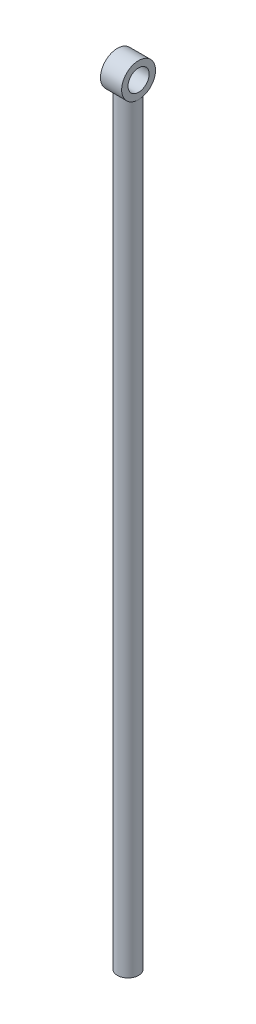
ISO-10303-21;
HEADER;
FILE_DESCRIPTION(('STEP AP214'),'2;1');
FILE_NAME('part.step','',(''),(''),'','','');
FILE_SCHEMA(('AUTOMOTIVE_DESIGN { 1 0 10303 214 1 1 1 1 }'));
ENDSEC;
DATA;
#1=APPLICATION_CONTEXT('core data for automotive mechanical design processes');
#2=APPLICATION_PROTOCOL_DEFINITION('international standard','automotive_design',2000,#1);
#3=PRODUCT_CONTEXT('',#1,'mechanical');
#4=PRODUCT('Part','Part','',(#3));
#5=PRODUCT_RELATED_PRODUCT_CATEGORY('part','',(#4));
#6=PRODUCT_DEFINITION_FORMATION('','',#4);
#7=PRODUCT_DEFINITION_CONTEXT('part definition',#1,'design');
#8=PRODUCT_DEFINITION('design','',#6,#7);
#9=PRODUCT_DEFINITION_SHAPE('','',#8);
#10=(LENGTH_UNIT() NAMED_UNIT(*) SI_UNIT(.MILLI.,.METRE.));
#11=(NAMED_UNIT(*) PLANE_ANGLE_UNIT() SI_UNIT($,.RADIAN.));
#12=(NAMED_UNIT(*) SI_UNIT($,.STERADIAN.) SOLID_ANGLE_UNIT());
#13=UNCERTAINTY_MEASURE_WITH_UNIT(LENGTH_MEASURE(1.E-05),#10,'distance_accuracy_value','');
#14=(GEOMETRIC_REPRESENTATION_CONTEXT(3) GLOBAL_UNCERTAINTY_ASSIGNED_CONTEXT((#13)) GLOBAL_UNIT_ASSIGNED_CONTEXT((#10,
#11,#12)) REPRESENTATION_CONTEXT('',''));
#15=CARTESIAN_POINT('',(0.,0.,0.));
#16=DIRECTION('',(0.,0.,1.));
#17=DIRECTION('',(1.,0.,0.));
#18=AXIS2_PLACEMENT_3D('',#15,#16,#17);
#19=CARTESIAN_POINT('',(0.,360.,0.));
#20=DIRECTION('',(0.,-1.,0.));
#21=DIRECTION('',(0.,0.,-1.));
#22=AXIS2_PLACEMENT_3D('',#19,#20,#21);
#23=CYLINDRICAL_SURFACE('',#22,5.);
#24=CARTESIAN_POINT('',(0.,0.,0.));
#25=DIRECTION('',(0.,1.,0.));
#26=DIRECTION('',(0.,0.,1.));
#27=AXIS2_PLACEMENT_3D('',#24,#25,#26);
#28=CIRCLE('',#27,5.);
#29=CARTESIAN_POINT('',(0.,0.,5.));
#30=VERTEX_POINT('',#29);
#31=EDGE_CURVE('E11',#30,#30,#28,.T.);
#32=ORIENTED_EDGE('',*,*,#31,.T.);
#33=EDGE_LOOP('',(#32));
#34=FACE_BOUND('',#33,.T.);
#35=CARTESIAN_POINT('',(0.,360.,-5.));
#36=CARTESIAN_POINT('',(-0.124309997084918,359.999998007565,-4.99999874728376));
#37=CARTESIAN_POINT('',(-0.248643911922186,359.996272056047,-4.99535477639502));
#38=CARTESIAN_POINT('',(-0.496242345217847,359.98153566141,-4.97686385741702));
#39=CARTESIAN_POINT('',(-0.619506190474295,359.97052092786,-4.96301148892208));
#40=CARTESIAN_POINT('',(-0.864132894108495,359.941669819841,-4.92631685582622));
#41=CARTESIAN_POINT('',(-0.985491401070761,359.923819686719,-4.90345645667282));
#42=CARTESIAN_POINT('',(-1.22521846002732,359.882042990426,-4.84912073775945));
#43=CARTESIAN_POINT('',(-1.34358548492504,359.858113390038,-4.81764111134031));
#44=CARTESIAN_POINT('',(-1.69098285176997,359.779010893722,-4.7115563432738));
#45=CARTESIAN_POINT('',(-1.91472159134201,359.716209555029,-4.62493071881549));
#46=CARTESIAN_POINT('',(-2.34407629105236,359.577674916331,-4.42286683667302));
#47=CARTESIAN_POINT('',(-2.54969175663767,359.50194126359,-4.30742779304935));
#48=CARTESIAN_POINT('',(-2.96744141301672,359.333817972129,-4.03296948836376));
#49=CARTESIAN_POINT('',(-3.17674952950576,359.240556872109,-3.8701813405658));
#50=CARTESIAN_POINT('',(-3.56756025653042,359.054872753188,-3.51319765959101));
#51=CARTESIAN_POINT('',(-3.74903864049326,358.962450529654,-3.31897506071617));
#52=CARTESIAN_POINT('',(-4.00760626149245,358.825108279934,-2.99356128179163));
#53=CARTESIAN_POINT('',(-4.09554829341699,358.777146091389,-2.87212880091626));
#54=CARTESIAN_POINT('',(-4.26075951717281,358.685279235645,-2.62078661715023));
#55=CARTESIAN_POINT('',(-4.33803318685167,358.641372868667,-2.49088050482951));
#56=CARTESIAN_POINT('',(-4.48104536831486,358.558883217121,-2.22333771815376));
#57=CARTESIAN_POINT('',(-4.54678952615798,358.520297329078,-2.08570487145723));
#58=CARTESIAN_POINT('',(-4.66588913640083,358.449600467625,-1.80358193532003));
#59=CARTESIAN_POINT('',(-4.71924684175159,358.417488316858,-1.6590930986712));
#60=CARTESIAN_POINT('',(-4.80795741869211,358.363669207293,-1.37943032429723));
#61=CARTESIAN_POINT('',(-4.84458864196752,358.34123664256,-1.24480106420069));
#62=CARTESIAN_POINT('',(-4.90659427549434,358.30307955529,-0.972050692903692));
#63=CARTESIAN_POINT('',(-4.93197055516711,358.287353918763,-0.833930165626433));
#64=CARTESIAN_POINT('',(-4.97102838824165,358.263087877842,-0.555534462309615));
#65=CARTESIAN_POINT('',(-4.98471957483722,358.254541554912,-0.415261158337181));
#66=CARTESIAN_POINT('',(-5.00019508535282,358.24487844314,-0.133810084943763));
#67=CARTESIAN_POINT('',(-5.00198077978344,358.243760799139,0.00736757849821506));
#68=CARTESIAN_POINT('',(-4.99418306842006,358.248632554868,0.270239609899382));
#69=CARTESIAN_POINT('',(-4.9860972278415,358.253685822555,0.39199931007294));
#70=CARTESIAN_POINT('',(-4.96109950689231,358.269259010068,0.634293592306145));
#71=CARTESIAN_POINT('',(-4.94418498400023,358.279780566609,0.754827796543434));
#72=CARTESIAN_POINT('',(-4.90175195667388,358.306050119114,0.993750416290308));
#73=CARTESIAN_POINT('',(-4.8762363638823,358.321796346389,1.11213954368104));
#74=CARTESIAN_POINT('',(-4.81691536004191,358.358165167553,1.34607315554107));
#75=CARTESIAN_POINT('',(-4.78310674467799,358.378789646223,1.46161652141073));
#76=CARTESIAN_POINT('',(-4.66961406787293,358.447459624946,1.80341623892686));
#77=CARTESIAN_POINT('',(-4.57793007291278,358.502259128836,2.0244725048806));
#78=CARTESIAN_POINT('',(-4.36611560771666,358.625577086435,2.44811588786114));
#79=CARTESIAN_POINT('',(-4.24597865675437,358.69409866507,2.6506987826293));
#80=CARTESIAN_POINT('',(-3.96389668023518,358.849263856553,3.05883635403528));
#81=CARTESIAN_POINT('',(-3.79860933546551,358.93710150445,3.2616234577039));
#82=CARTESIAN_POINT('',(-3.43944259665052,359.117195837692,3.63842034253163));
#83=CARTESIAN_POINT('',(-3.24552165003414,359.209458811363,3.8123875088261));
#84=CARTESIAN_POINT('',(-2.92199806035765,359.351010209083,4.0599992315947));
#85=CARTESIAN_POINT('',(-2.80103153254674,359.401562708011,4.14440430037548));
#86=CARTESIAN_POINT('',(-2.55125114008687,359.499948096976,4.30267035241463));
#87=CARTESIAN_POINT('',(-2.42243580756728,359.547780475045,4.37652935467606));
#88=CARTESIAN_POINT('',(-2.15770926568202,359.638917853974,4.51291782494086));
#89=CARTESIAN_POINT('',(-2.02181056536113,359.68223045587,4.57546644816391));
#90=CARTESIAN_POINT('',(-1.74330768244431,359.762608760656,4.6886516739402));
#91=CARTESIAN_POINT('',(-1.60070353986483,359.799674500819,4.7392883475702));
#92=CARTESIAN_POINT('',(-1.34808415551626,359.857006889507,4.81614194168603));
#93=CARTESIAN_POINT('',(-1.23937010533178,359.879127370953,4.84527833481626));
#94=CARTESIAN_POINT('',(-1.01935900201233,359.918277984814,4.89628944573215));
#95=CARTESIAN_POINT('',(-0.908062541381955,359.935309272682,4.91816581196151));
#96=CARTESIAN_POINT('',(-0.683654493147994,359.963675521877,4.95434333722363));
#97=CARTESIAN_POINT('',(-0.570545140796199,359.975017013276,4.96865318123363));
#98=CARTESIAN_POINT('',(-0.343158274667119,359.991606676616,4.98951663397229));
#99=CARTESIAN_POINT('',(-0.228880713516888,359.996854600455,4.99606992689043));
#100=CARTESIAN_POINT('',(0.000213756327490701,360.001052358672,5.00131530513999));
#101=CARTESIAN_POINT('',(0.115031294285475,359.999988878985,4.99999077198392));
#102=CARTESIAN_POINT('',(0.344110589839982,359.991574764979,4.98946310366481));
#103=CARTESIAN_POINT('',(0.458372127783298,359.984221821285,4.98025707456074));
#104=CARTESIAN_POINT('',(0.685492435641908,359.963508585134,4.95410620951325));
#105=CARTESIAN_POINT('',(0.798350719467884,359.950146267493,4.93715876465219));
#106=CARTESIAN_POINT('',(1.0219036819471,359.917911444254,4.89577944983109));
#107=CARTESIAN_POINT('',(1.13259744525955,359.899036659083,4.87134448334738));
#108=CARTESIAN_POINT('',(1.4567411431601,359.835800605763,4.78821642821574));
#109=CARTESIAN_POINT('',(1.66627772710242,359.784420789243,4.71921780239626));
#110=CARTESIAN_POINT('',(2.07118631830436,359.668373155149,4.55609149726));
#111=CARTESIAN_POINT('',(2.26655326684992,359.603700623215,4.46195489902186));
#112=CARTESIAN_POINT('',(2.6772057547784,359.453512928601,4.23062377482237));
#113=CARTESIAN_POINT('',(2.88920195195317,359.366373804104,4.08864375810926));
#114=CARTESIAN_POINT('',(3.28876845285958,359.189228834856,3.77473221644166));
#115=CARTESIAN_POINT('',(3.47631305761314,359.099220095758,3.60276961587647));
#116=CARTESIAN_POINT('',(3.75109437385406,358.960551206496,3.30924585333195));
#117=CARTESIAN_POINT('',(3.84742308399407,358.910374908199,3.19677534649595));
#118=CARTESIAN_POINT('',(4.03023211498253,358.812852605234,2.96297696798605));
#119=CARTESIAN_POINT('',(4.11671614194506,358.765505538688,2.84165245789282));
#120=CARTESIAN_POINT('',(4.2791254427619,358.674900564588,2.59064393379968));
#121=CARTESIAN_POINT('',(4.35504857193851,358.631643488187,2.46095822963463));
#122=CARTESIAN_POINT('',(4.4954411036896,358.550473246638,2.19402109584817));
#123=CARTESIAN_POINT('',(4.55991768393771,358.512556735739,2.05677447863479));
#124=CARTESIAN_POINT('',(4.67313922374356,358.445236197944,1.7838948857944));
#125=CARTESIAN_POINT('',(4.72258893611768,358.415461409837,1.64864631402089));
#126=CARTESIAN_POINT('',(4.80988250173738,358.362500609297,1.37327166975234));
#127=CARTESIAN_POINT('',(4.84773307297854,358.339310783556,1.23314847311437));
#128=CARTESIAN_POINT('',(4.91121075887916,358.300228288798,0.949284871547685));
#129=CARTESIAN_POINT('',(4.93684853590453,358.284329255018,0.805547737630296));
#130=CARTESIAN_POINT('',(4.97547600812264,358.260317016327,0.515747890604332));
#131=CARTESIAN_POINT('',(4.98846779564148,358.252202523437,0.369685566273068));
#132=CARTESIAN_POINT('',(5.0005918204771,358.244629000036,0.0984542398463212));
#133=CARTESIAN_POINT('',(5.00148999709849,358.24406713934,-0.026609190110814));
#134=CARTESIAN_POINT('',(4.99391869226614,358.248798025125,-0.276384426548526));
#135=CARTESIAN_POINT('',(4.98544635104714,358.254092558904,-0.401096114033615));
#136=CARTESIAN_POINT('',(4.95925462589747,358.270406968244,-0.649105048465732));
#137=CARTESIAN_POINT('',(4.9415393086947,358.281424325865,-0.772402893113301));
#138=CARTESIAN_POINT('',(4.89709863543924,358.30892398313,-1.01678782002799));
#139=CARTESIAN_POINT('',(4.87036980485837,358.325408390172,-1.13787403075125));
#140=CARTESIAN_POINT('',(4.80933512611736,358.362793821247,-1.37276960676343));
#141=CARTESIAN_POINT('',(4.77532902296418,358.383519005112,-1.48668509743704));
#142=CARTESIAN_POINT('',(4.6996107156699,358.42928071637,-1.7110511268817));
#143=CARTESIAN_POINT('',(4.65789587685612,358.454318717587,-1.8215004658563));
#144=CARTESIAN_POINT('',(4.52179700785275,358.535180916951,-2.14674322952905));
#145=CARTESIAN_POINT('',(4.41641101660219,358.596783168648,-2.35561190892493));
#146=CARTESIAN_POINT('',(4.16734603403118,358.737989978439,-2.77466231937416));
#147=CARTESIAN_POINT('',(4.02082779517781,358.81879941732,-2.98273013480182));
#148=CARTESIAN_POINT('',(3.69969776307277,358.987650860826,-3.37285679634258));
#149=CARTESIAN_POINT('',(3.525054269891,359.075700970946,-3.55488585185799));
#150=CARTESIAN_POINT('',(3.12352869133321,359.264981850046,-3.91489797533943));
#151=CARTESIAN_POINT('',(2.89274538552559,359.366283105529,-4.08851588919806));
#152=CARTESIAN_POINT('',(2.40144255795415,359.558005173515,-4.39509030747831));
#153=CARTESIAN_POINT('',(2.14093959230363,359.648431986794,-4.52806930044203));
#154=CARTESIAN_POINT('',(1.65432760274294,359.787806490967,-4.72397005512009));
#155=CARTESIAN_POINT('',(1.43325185965491,359.841502752982,-4.79586701428081));
#156=CARTESIAN_POINT('',(1.09324362690457,359.906010430911,-4.88041603953432));
#157=CARTESIAN_POINT('',(0.978627920072902,359.924829309972,-4.90470355408436));
#158=CARTESIAN_POINT('',(0.747193668969995,359.956500614277,-4.94524770814466));
#159=CARTESIAN_POINT('',(0.630376290428706,359.969356109483,-4.9615084801139));
#160=CARTESIAN_POINT('',(0.42789508697906,359.985932100257,-4.98239032952821));
#161=CARTESIAN_POINT('',(0.342553322442697,359.991195898123,-4.98898701036639));
#162=CARTESIAN_POINT('',(0.171478227136924,359.998230974298,-4.99779282932784));
#163=CARTESIAN_POINT('',(0.0857448033274915,360.000001374314,-5.00000086408101));
#164=CARTESIAN_POINT('',(0.,360.,-5.));
#165=B_SPLINE_CURVE_WITH_KNOTS('',3,(#35,#36,#37,#38,#39,#40,#41,#42,#43,#44,#45,#46,#47,#48,
#49,#50,#51,#52,#53,#54,#55,#56,#57,#58,#59,#60,#61,#62,#63,#64,#65,#66,#67,#68,#69,#70,#71,#72,
#73,#74,#75,#76,#77,#78,#79,#80,#81,#82,#83,#84,#85,#86,#87,#88,#89,#90,#91,#92,#93,#94,#95,#96,
#97,#98,#99,#100,#101,#102,#103,#104,#105,#106,#107,#108,#109,#110,#111,#112,#113,#114,#115,
#116,#117,#118,#119,#120,#121,#122,#123,#124,#125,#126,#127,#128,#129,#130,#131,#132,#133,#134,
#135,#136,#137,#138,#139,#140,#141,#142,#143,#144,#145,#146,#147,#148,#149,#150,#151,#152,#153,
#154,#155,#156,#157,#158,#159,#160,#161,#162,#163,#164),.UNSPECIFIED.,.T.,.F.,(4,2,2,2,2,2,2,2,
2,2,2,2,2,2,2,2,2,2,2,2,2,2,2,2,2,2,2,2,2,2,2,2,2,2,2,2,2,2,2,2,2,2,2,2,2,2,2,2,2,2,2,2,2,2,2,2,
2,2,2,2,2,2,2,2,4),(0.,0.372830631717397,0.745880919988999,1.11968608457865,1.49367836553753,
2.23437397247081,2.97508978546026,3.81517657771249,4.65599058786118,5.12769727095082,
5.59920535801266,6.07048189652379,6.54167264805616,6.96500037161671,7.38825775501684,
7.8111658669397,8.23402529460411,8.59998197802636,8.96604825916241,9.33199074341865,
9.69807484639391,10.4313641163756,11.1648205684642,11.9895533165928,12.8154948839412,
13.2827866246025,13.750166027248,14.2167463086997,14.6833238060682,15.0271003394338,
15.3707987622619,15.7141018213498,16.0574188576537,16.4014603870609,16.7456282964258,
17.0899122787371,17.4343388350078,18.1111129623981,18.7881275281776,19.594037813102,
20.4007884080993,20.8693475683428,21.3377297480671,21.8062069071062,22.2743892571628,
22.7148894158782,23.1551339612148,23.594993443916,24.0347801378503,24.409509228706,
24.7843527137741,25.1590314139736,25.5338547106938,25.8954875601863,26.2572442370256,
26.9801965139639,27.7781872367986,28.5770837508034,29.4911341692987,30.4046778558642,
31.1173375632653,31.4729528456561,31.8283848529183,32.0854860972179,32.3426519723746),.UNSPECIFIED.);
#166=CARTESIAN_POINT('',(-5.,358.244997998398,0.));
#167=VERTEX_POINT('',#166);
#168=CARTESIAN_POINT('',(5.00000000000002,358.244997998398,0.));
#169=VERTEX_POINT('',#168);
#170=EDGE_CURVE('E51',#167,#169,#165,.T.);
#171=ORIENTED_EDGE('',*,*,#170,.F.);
#172=EDGE_CURVE('E58',#169,#167,#165,.T.);
#173=ORIENTED_EDGE('',*,*,#172,.F.);
#174=EDGE_LOOP('',(#171,#173));
#175=FACE_BOUND('',#174,.T.);
#176=ADVANCED_FACE('F42',(#34,#175),#23,.T.);
#177=CARTESIAN_POINT('',(0.,0.,0.));
#178=DIRECTION('',(0.,1.,0.));
#179=DIRECTION('',(0.,0.,1.));
#180=AXIS2_PLACEMENT_3D('',#177,#178,#179);
#181=PLANE('',#180);
#182=ORIENTED_EDGE('',*,*,#31,.F.);
#183=EDGE_LOOP('',(#182));
#184=FACE_BOUND('',#183,.T.);
#185=ADVANCED_FACE('F87',(#184),#181,.F.);
#186=CARTESIAN_POINT('',(5.,366.244997998398,0.));
#187=DIRECTION('',(-1.,0.,0.));
#188=DIRECTION('',(0.,0.,1.));
#189=AXIS2_PLACEMENT_3D('',#186,#187,#188);
#190=CYLINDRICAL_SURFACE('',#189,8.00000000000002);
#191=CARTESIAN_POINT('',(-5.,366.244997998398,0.));
#192=DIRECTION('',(1.,0.,0.));
#193=DIRECTION('',(0.,0.,-1.));
#194=AXIS2_PLACEMENT_3D('',#191,#192,#193);
#195=CIRCLE('',#194,8.00000000000002);
#196=EDGE_CURVE('E65',#167,#167,#195,.T.);
#197=ORIENTED_EDGE('',*,*,#196,.T.);
#198=ORIENTED_EDGE('',*,*,#170,.T.);
#199=CARTESIAN_POINT('',(5.,366.244997998398,0.));
#200=DIRECTION('',(1.,0.,0.));
#201=DIRECTION('',(0.,0.,-1.));
#202=AXIS2_PLACEMENT_3D('',#199,#200,#201);
#203=CIRCLE('',#202,8.00000000000002);
#204=EDGE_CURVE('E63',#169,#169,#203,.T.);
#205=ORIENTED_EDGE('',*,*,#204,.F.);
#206=ORIENTED_EDGE('',*,*,#172,.T.);
#207=EDGE_LOOP('',(#197,#198,#205,#206));
#208=FACE_BOUND('',#207,.T.);
#209=ADVANCED_FACE('F61',(#208),#190,.T.);
#210=CARTESIAN_POINT('',(5.,366.244997998398,0.));
#211=DIRECTION('',(1.,0.,0.));
#212=DIRECTION('',(0.,0.,-1.));
#213=AXIS2_PLACEMENT_3D('',#210,#211,#212);
#214=PLANE('',#213);
#215=ORIENTED_EDGE('',*,*,#204,.T.);
#216=EDGE_LOOP('',(#215));
#217=FACE_BOUND('',#216,.T.);
#218=CARTESIAN_POINT('',(5.,366.244997998398,0.));
#219=DIRECTION('',(1.,0.,0.));
#220=DIRECTION('',(0.,0.,-1.));
#221=AXIS2_PLACEMENT_3D('',#218,#219,#220);
#222=CIRCLE('',#221,5.);
#223=CARTESIAN_POINT('',(5.,366.244997998398,-5.));
#224=VERTEX_POINT('',#223);
#225=EDGE_CURVE('E75',#224,#224,#222,.T.);
#226=ORIENTED_EDGE('',*,*,#225,.F.);
#227=EDGE_LOOP('',(#226));
#228=FACE_BOUND('',#227,.T.);
#229=ADVANCED_FACE('F70',(#217,#228),#214,.T.);
#230=CARTESIAN_POINT('',(-5.,366.244997998398,0.));
#231=DIRECTION('',(1.,0.,0.));
#232=DIRECTION('',(0.,0.,-1.));
#233=AXIS2_PLACEMENT_3D('',#230,#231,#232);
#234=PLANE('',#233);
#235=ORIENTED_EDGE('',*,*,#196,.F.);
#236=EDGE_LOOP('',(#235));
#237=FACE_BOUND('',#236,.T.);
#238=CARTESIAN_POINT('',(-5.,366.244997998398,0.));
#239=DIRECTION('',(1.,0.,0.));
#240=DIRECTION('',(0.,0.,-1.));
#241=AXIS2_PLACEMENT_3D('',#238,#239,#240);
#242=CIRCLE('',#241,5.);
#243=CARTESIAN_POINT('',(-5.,366.244997998398,-5.));
#244=VERTEX_POINT('',#243);
#245=EDGE_CURVE('E78',#244,#244,#242,.T.);
#246=ORIENTED_EDGE('',*,*,#245,.T.);
#247=EDGE_LOOP('',(#246));
#248=FACE_BOUND('',#247,.T.);
#249=ADVANCED_FACE('F88',(#237,#248),#234,.F.);
#250=CARTESIAN_POINT('',(5.,366.244997998398,0.));
#251=DIRECTION('',(-1.,0.,0.));
#252=DIRECTION('',(0.,0.,1.));
#253=AXIS2_PLACEMENT_3D('',#250,#251,#252);
#254=CYLINDRICAL_SURFACE('',#253,5.);
#255=ORIENTED_EDGE('',*,*,#225,.T.);
#256=EDGE_LOOP('',(#255));
#257=FACE_BOUND('',#256,.T.);
#258=ORIENTED_EDGE('',*,*,#245,.F.);
#259=EDGE_LOOP('',(#258));
#260=FACE_BOUND('',#259,.T.);
#261=ADVANCED_FACE('F126',(#257,#260),#254,.F.);
#262=CLOSED_SHELL('',(#176,#185,#209,#229,#249,#261));
#263=MANIFOLD_SOLID_BREP('B2',#262);
#264=ADVANCED_BREP_SHAPE_REPRESENTATION('',(#18,#263),#14);
#265=SHAPE_DEFINITION_REPRESENTATION(#9,#264);
ENDSEC;
END-ISO-10303-21;
